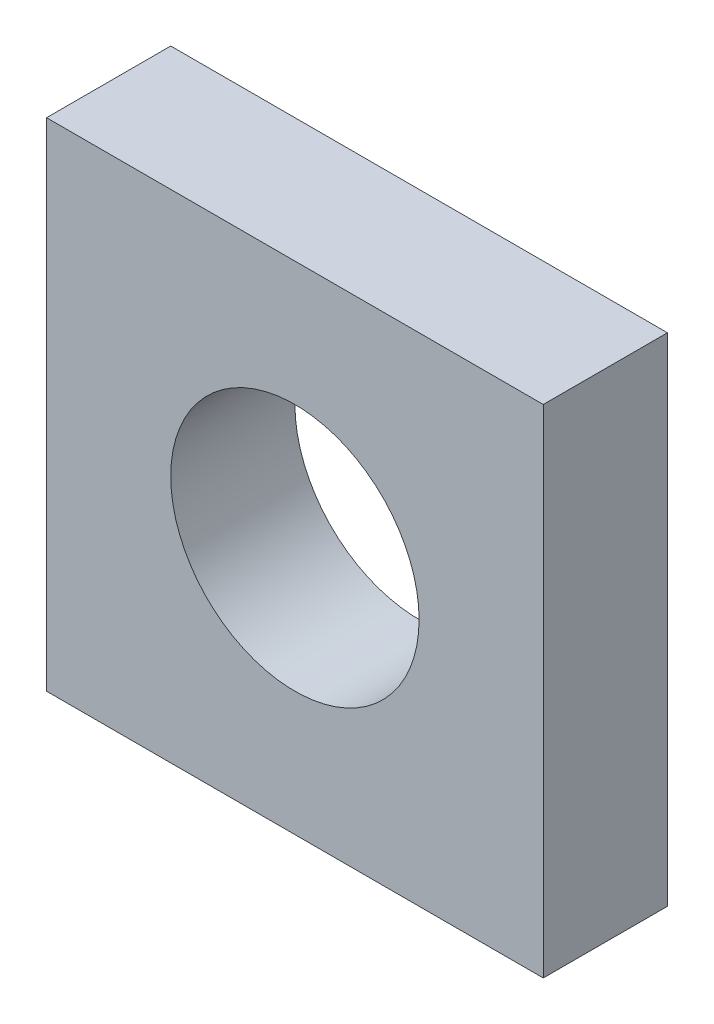
ISO-10303-21;
HEADER;
FILE_DESCRIPTION(('STEP AP214'),'2;1');
FILE_NAME('part.step','',(''),(''),'','','');
FILE_SCHEMA(('AUTOMOTIVE_DESIGN { 1 0 10303 214 1 1 1 1 }'));
ENDSEC;
DATA;
#1=APPLICATION_CONTEXT('core data for automotive mechanical design processes');
#2=APPLICATION_PROTOCOL_DEFINITION('international standard','automotive_design',2000,#1);
#3=PRODUCT_CONTEXT('',#1,'mechanical');
#4=PRODUCT('Part','Part','',(#3));
#5=PRODUCT_RELATED_PRODUCT_CATEGORY('part','',(#4));
#6=PRODUCT_DEFINITION_FORMATION('','',#4);
#7=PRODUCT_DEFINITION_CONTEXT('part definition',#1,'design');
#8=PRODUCT_DEFINITION('design','',#6,#7);
#9=PRODUCT_DEFINITION_SHAPE('','',#8);
#10=(LENGTH_UNIT() NAMED_UNIT(*) SI_UNIT(.MILLI.,.METRE.));
#11=(NAMED_UNIT(*) PLANE_ANGLE_UNIT() SI_UNIT($,.RADIAN.));
#12=(NAMED_UNIT(*) SI_UNIT($,.STERADIAN.) SOLID_ANGLE_UNIT());
#13=UNCERTAINTY_MEASURE_WITH_UNIT(LENGTH_MEASURE(1.E-05),#10,'distance_accuracy_value','');
#14=(GEOMETRIC_REPRESENTATION_CONTEXT(3) GLOBAL_UNCERTAINTY_ASSIGNED_CONTEXT((#13)) GLOBAL_UNIT_ASSIGNED_CONTEXT((#10,
#11,#12)) REPRESENTATION_CONTEXT('',''));
#15=CARTESIAN_POINT('',(0.,0.,0.));
#16=DIRECTION('',(0.,0.,1.));
#17=DIRECTION('',(1.,0.,0.));
#18=AXIS2_PLACEMENT_3D('',#15,#16,#17);
#19=CARTESIAN_POINT('',(0.,0.,10.));
#20=DIRECTION('',(0.,0.,-1.));
#21=DIRECTION('',(-1.,0.,0.));
#22=AXIS2_PLACEMENT_3D('',#19,#20,#21);
#23=PLANE('',#22);
#24=DIRECTION('',(0.,1.,0.));
#25=VECTOR('',#24,1.);
#26=CARTESIAN_POINT('',(20.,-20.,10.));
#27=LINE('',#26,#25);
#28=CARTESIAN_POINT('',(20.,-20.,10.));
#29=VERTEX_POINT('',#28);
#30=CARTESIAN_POINT('',(20.,20.,10.));
#31=VERTEX_POINT('',#30);
#32=EDGE_CURVE('E85',#29,#31,#27,.T.);
#33=ORIENTED_EDGE('',*,*,#32,.T.);
#34=DIRECTION('',(-1.,0.,0.));
#35=VECTOR('',#34,1.);
#36=CARTESIAN_POINT('',(-20.,20.,10.));
#37=LINE('',#36,#35);
#38=CARTESIAN_POINT('',(-20.,20.,10.));
#39=VERTEX_POINT('',#38);
#40=EDGE_CURVE('E80',#31,#39,#37,.T.);
#41=ORIENTED_EDGE('',*,*,#40,.T.);
#42=DIRECTION('',(0.,-1.,0.));
#43=VECTOR('',#42,1.);
#44=CARTESIAN_POINT('',(-20.,-20.,10.));
#45=LINE('',#44,#43);
#46=CARTESIAN_POINT('',(-20.,-20.,10.));
#47=VERTEX_POINT('',#46);
#48=EDGE_CURVE('E83',#39,#47,#45,.T.);
#49=ORIENTED_EDGE('',*,*,#48,.T.);
#50=DIRECTION('',(1.,0.,0.));
#51=VECTOR('',#50,1.);
#52=CARTESIAN_POINT('',(-20.,-20.,10.));
#53=LINE('',#52,#51);
#54=EDGE_CURVE('E50',#47,#29,#53,.T.);
#55=ORIENTED_EDGE('',*,*,#54,.T.);
#56=EDGE_LOOP('',(#33,#41,#49,#55));
#57=FACE_BOUND('',#56,.T.);
#58=CARTESIAN_POINT('',(0.,0.,10.));
#59=DIRECTION('',(0.,0.,1.));
#60=DIRECTION('',(1.,0.,0.));
#61=AXIS2_PLACEMENT_3D('',#58,#59,#60);
#62=CIRCLE('',#61,10.);
#63=CARTESIAN_POINT('',(10.,0.,10.));
#64=VERTEX_POINT('',#63);
#65=EDGE_CURVE('E100',#64,#64,#62,.T.);
#66=ORIENTED_EDGE('',*,*,#65,.F.);
#67=EDGE_LOOP('',(#66));
#68=FACE_BOUND('',#67,.T.);
#69=ADVANCED_FACE('F33',(#57,#68),#23,.F.);
#70=CARTESIAN_POINT('',(0.,0.,0.));
#71=DIRECTION('',(0.,0.,-1.));
#72=DIRECTION('',(-1.,0.,0.));
#73=AXIS2_PLACEMENT_3D('',#70,#71,#72);
#74=PLANE('',#73);
#75=DIRECTION('',(0.,1.,0.));
#76=VECTOR('',#75,1.);
#77=CARTESIAN_POINT('',(20.,-20.,0.));
#78=LINE('',#77,#76);
#79=CARTESIAN_POINT('',(20.,-20.,0.));
#80=VERTEX_POINT('',#79);
#81=CARTESIAN_POINT('',(20.,20.,0.));
#82=VERTEX_POINT('',#81);
#83=EDGE_CURVE('E97',#80,#82,#78,.T.);
#84=ORIENTED_EDGE('',*,*,#83,.F.);
#85=DIRECTION('',(1.,0.,0.));
#86=VECTOR('',#85,1.);
#87=CARTESIAN_POINT('',(-20.,-20.,0.));
#88=LINE('',#87,#86);
#89=CARTESIAN_POINT('',(-20.,-20.,0.));
#90=VERTEX_POINT('',#89);
#91=EDGE_CURVE('E73',#90,#80,#88,.T.);
#92=ORIENTED_EDGE('',*,*,#91,.F.);
#93=DIRECTION('',(0.,-1.,0.));
#94=VECTOR('',#93,1.);
#95=CARTESIAN_POINT('',(-20.,-20.,0.));
#96=LINE('',#95,#94);
#97=CARTESIAN_POINT('',(-20.,20.,0.));
#98=VERTEX_POINT('',#97);
#99=EDGE_CURVE('E67',#98,#90,#96,.T.);
#100=ORIENTED_EDGE('',*,*,#99,.F.);
#101=DIRECTION('',(-1.,0.,0.));
#102=VECTOR('',#101,1.);
#103=CARTESIAN_POINT('',(-20.,20.,0.));
#104=LINE('',#103,#102);
#105=EDGE_CURVE('E89',#82,#98,#104,.T.);
#106=ORIENTED_EDGE('',*,*,#105,.F.);
#107=EDGE_LOOP('',(#84,#92,#100,#106));
#108=FACE_BOUND('',#107,.T.);
#109=CARTESIAN_POINT('',(0.,0.,0.));
#110=DIRECTION('',(0.,0.,1.));
#111=DIRECTION('',(1.,0.,0.));
#112=AXIS2_PLACEMENT_3D('',#109,#110,#111);
#113=CIRCLE('',#112,10.);
#114=CARTESIAN_POINT('',(10.,0.,0.));
#115=VERTEX_POINT('',#114);
#116=EDGE_CURVE('E112',#115,#115,#113,.T.);
#117=ORIENTED_EDGE('',*,*,#116,.T.);
#118=EDGE_LOOP('',(#117));
#119=FACE_BOUND('',#118,.T.);
#120=ADVANCED_FACE('F108',(#108,#119),#74,.T.);
#121=CARTESIAN_POINT('',(20.,-20.,10.));
#122=DIRECTION('',(-1.,0.,0.));
#123=DIRECTION('',(0.,0.,1.));
#124=AXIS2_PLACEMENT_3D('',#121,#122,#123);
#125=PLANE('',#124);
#126=ORIENTED_EDGE('',*,*,#83,.T.);
#127=DIRECTION('',(0.,0.,-1.));
#128=VECTOR('',#127,1.);
#129=CARTESIAN_POINT('',(20.,20.,10.));
#130=LINE('',#129,#128);
#131=EDGE_CURVE('E11',#31,#82,#130,.T.);
#132=ORIENTED_EDGE('',*,*,#131,.F.);
#133=ORIENTED_EDGE('',*,*,#32,.F.);
#134=DIRECTION('',(0.,0.,-1.));
#135=VECTOR('',#134,1.);
#136=CARTESIAN_POINT('',(20.,-20.,10.));
#137=LINE('',#136,#135);
#138=EDGE_CURVE('E93',#29,#80,#137,.T.);
#139=ORIENTED_EDGE('',*,*,#138,.T.);
#140=EDGE_LOOP('',(#126,#132,#133,#139));
#141=FACE_BOUND('',#140,.T.);
#142=ADVANCED_FACE('F35',(#141),#125,.F.);
#143=CARTESIAN_POINT('',(-20.,20.,10.));
#144=DIRECTION('',(0.,-1.,0.));
#145=DIRECTION('',(0.,0.,-1.));
#146=AXIS2_PLACEMENT_3D('',#143,#144,#145);
#147=PLANE('',#146);
#148=ORIENTED_EDGE('',*,*,#105,.T.);
#149=DIRECTION('',(0.,0.,-1.));
#150=VECTOR('',#149,1.);
#151=CARTESIAN_POINT('',(-20.,20.,10.));
#152=LINE('',#151,#150);
#153=EDGE_CURVE('E42',#39,#98,#152,.T.);
#154=ORIENTED_EDGE('',*,*,#153,.F.);
#155=ORIENTED_EDGE('',*,*,#40,.F.);
#156=ORIENTED_EDGE('',*,*,#131,.T.);
#157=EDGE_LOOP('',(#148,#154,#155,#156));
#158=FACE_BOUND('',#157,.T.);
#159=ADVANCED_FACE('F88',(#158),#147,.F.);
#160=CARTESIAN_POINT('',(-20.,-20.,10.));
#161=DIRECTION('',(1.,0.,0.));
#162=DIRECTION('',(0.,0.,-1.));
#163=AXIS2_PLACEMENT_3D('',#160,#161,#162);
#164=PLANE('',#163);
#165=ORIENTED_EDGE('',*,*,#99,.T.);
#166=DIRECTION('',(0.,0.,-1.));
#167=VECTOR('',#166,1.);
#168=CARTESIAN_POINT('',(-20.,-20.,10.));
#169=LINE('',#168,#167);
#170=EDGE_CURVE('E90',#47,#90,#169,.T.);
#171=ORIENTED_EDGE('',*,*,#170,.F.);
#172=ORIENTED_EDGE('',*,*,#48,.F.);
#173=ORIENTED_EDGE('',*,*,#153,.T.);
#174=EDGE_LOOP('',(#165,#171,#172,#173));
#175=FACE_BOUND('',#174,.T.);
#176=ADVANCED_FACE('F91',(#175),#164,.F.);
#177=CARTESIAN_POINT('',(-20.,-20.,10.));
#178=DIRECTION('',(0.,1.,0.));
#179=DIRECTION('',(0.,0.,1.));
#180=AXIS2_PLACEMENT_3D('',#177,#178,#179);
#181=PLANE('',#180);
#182=ORIENTED_EDGE('',*,*,#91,.T.);
#183=ORIENTED_EDGE('',*,*,#138,.F.);
#184=ORIENTED_EDGE('',*,*,#54,.F.);
#185=ORIENTED_EDGE('',*,*,#170,.T.);
#186=EDGE_LOOP('',(#182,#183,#184,#185));
#187=FACE_BOUND('',#186,.T.);
#188=ADVANCED_FACE('F105',(#187),#181,.F.);
#189=CARTESIAN_POINT('',(0.,0.,10.));
#190=DIRECTION('',(0.,0.,-1.));
#191=DIRECTION('',(-1.,0.,0.));
#192=AXIS2_PLACEMENT_3D('',#189,#190,#191);
#193=CYLINDRICAL_SURFACE('',#192,10.);
#194=ORIENTED_EDGE('',*,*,#65,.T.);
#195=EDGE_LOOP('',(#194));
#196=FACE_BOUND('',#195,.T.);
#197=ORIENTED_EDGE('',*,*,#116,.F.);
#198=EDGE_LOOP('',(#197));
#199=FACE_BOUND('',#198,.T.);
#200=ADVANCED_FACE('F118',(#196,#199),#193,.F.);
#201=CLOSED_SHELL('',(#69,#120,#142,#159,#176,#188,#200));
#202=MANIFOLD_SOLID_BREP('B2',#201);
#203=ADVANCED_BREP_SHAPE_REPRESENTATION('',(#18,#202),#14);
#204=SHAPE_DEFINITION_REPRESENTATION(#9,#203);
ENDSEC;
END-ISO-10303-21;
